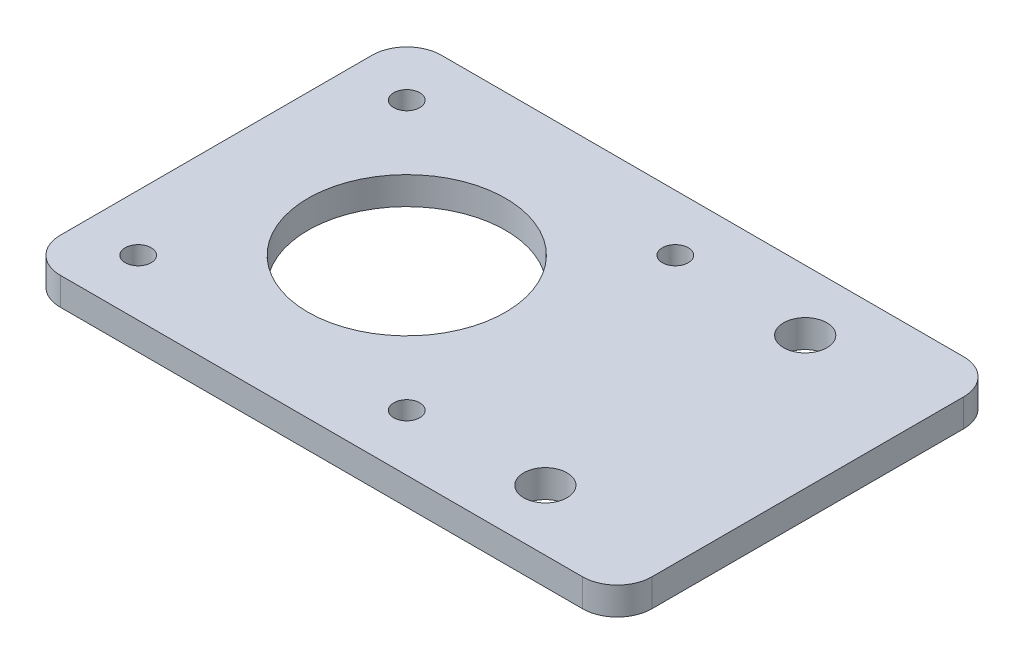
ISO-10303-21;
HEADER;
FILE_DESCRIPTION(('STEP AP214'),'2;1');
FILE_NAME('part.step','',(''),(''),'','','');
FILE_SCHEMA(('AUTOMOTIVE_DESIGN { 1 0 10303 214 1 1 1 1 }'));
ENDSEC;
DATA;
#1=APPLICATION_CONTEXT('core data for automotive mechanical design processes');
#2=APPLICATION_PROTOCOL_DEFINITION('international standard','automotive_design',2000,#1);
#3=PRODUCT_CONTEXT('',#1,'mechanical');
#4=PRODUCT('Part','Part','',(#3));
#5=PRODUCT_RELATED_PRODUCT_CATEGORY('part','',(#4));
#6=PRODUCT_DEFINITION_FORMATION('','',#4);
#7=PRODUCT_DEFINITION_CONTEXT('part definition',#1,'design');
#8=PRODUCT_DEFINITION('design','',#6,#7);
#9=PRODUCT_DEFINITION_SHAPE('','',#8);
#10=(LENGTH_UNIT() NAMED_UNIT(*) SI_UNIT(.MILLI.,.METRE.));
#11=(NAMED_UNIT(*) PLANE_ANGLE_UNIT() SI_UNIT($,.RADIAN.));
#12=(NAMED_UNIT(*) SI_UNIT($,.STERADIAN.) SOLID_ANGLE_UNIT());
#13=UNCERTAINTY_MEASURE_WITH_UNIT(LENGTH_MEASURE(1.E-05),#10,'distance_accuracy_value','');
#14=(GEOMETRIC_REPRESENTATION_CONTEXT(3) GLOBAL_UNCERTAINTY_ASSIGNED_CONTEXT((#13)) GLOBAL_UNIT_ASSIGNED_CONTEXT((#10,
#11,#12)) REPRESENTATION_CONTEXT('',''));
#15=CARTESIAN_POINT('',(0.,0.,0.));
#16=DIRECTION('',(0.,0.,1.));
#17=DIRECTION('',(1.,0.,0.));
#18=AXIS2_PLACEMENT_3D('',#15,#16,#17);
#19=CARTESIAN_POINT('',(34.15,3.2,-22.));
#20=DIRECTION('',(-1.,0.,0.));
#21=DIRECTION('',(0.,0.,1.));
#22=AXIS2_PLACEMENT_3D('',#19,#20,#21);
#23=PLANE('',#22);
#24=DIRECTION('',(0.,0.,-1.));
#25=VECTOR('',#24,1.);
#26=CARTESIAN_POINT('',(34.15,3.2,-22.));
#27=LINE('',#26,#25);
#28=CARTESIAN_POINT('',(34.15,3.2,18.));
#29=VERTEX_POINT('',#28);
#30=CARTESIAN_POINT('',(34.15,3.2,-18.));
#31=VERTEX_POINT('',#30);
#32=EDGE_CURVE('E117',#29,#31,#27,.T.);
#33=ORIENTED_EDGE('',*,*,#32,.F.);
#34=DIRECTION('',(0.,-1.,0.));
#35=VECTOR('',#34,1.);
#36=CARTESIAN_POINT('',(34.15,3.2,18.));
#37=LINE('',#36,#35);
#38=CARTESIAN_POINT('',(34.15,0.,18.));
#39=VERTEX_POINT('',#38);
#40=EDGE_CURVE('E102',#29,#39,#37,.T.);
#41=ORIENTED_EDGE('',*,*,#40,.T.);
#42=DIRECTION('',(0.,0.,-1.));
#43=VECTOR('',#42,1.);
#44=CARTESIAN_POINT('',(34.15,0.,-22.));
#45=LINE('',#44,#43);
#46=CARTESIAN_POINT('',(34.15,0.,-18.));
#47=VERTEX_POINT('',#46);
#48=EDGE_CURVE('E114',#39,#47,#45,.T.);
#49=ORIENTED_EDGE('',*,*,#48,.T.);
#50=DIRECTION('',(0.,-1.,0.));
#51=VECTOR('',#50,1.);
#52=CARTESIAN_POINT('',(34.15,3.2,-18.));
#53=LINE('',#52,#51);
#54=EDGE_CURVE('E119',#47,#31,#53,.F.);
#55=ORIENTED_EDGE('',*,*,#54,.T.);
#56=EDGE_LOOP('',(#33,#41,#49,#55));
#57=FACE_BOUND('',#56,.T.);
#58=ADVANCED_FACE('F32',(#57),#23,.F.);
#59=CARTESIAN_POINT('',(-34.15,3.2,-22.));
#60=DIRECTION('',(0.,0.,1.));
#61=DIRECTION('',(1.,0.,0.));
#62=AXIS2_PLACEMENT_3D('',#59,#60,#61);
#63=PLANE('',#62);
#64=DIRECTION('',(-1.,0.,0.));
#65=VECTOR('',#64,1.);
#66=CARTESIAN_POINT('',(-34.15,0.,-22.));
#67=LINE('',#66,#65);
#68=CARTESIAN_POINT('',(30.15,0.,-22.));
#69=VERTEX_POINT('',#68);
#70=CARTESIAN_POINT('',(-30.15,0.,-22.));
#71=VERTEX_POINT('',#70);
#72=EDGE_CURVE('E123',#69,#71,#67,.T.);
#73=ORIENTED_EDGE('',*,*,#72,.T.);
#74=DIRECTION('',(0.,-1.,0.));
#75=VECTOR('',#74,1.);
#76=CARTESIAN_POINT('',(-30.15,3.2,-22.));
#77=LINE('',#76,#75);
#78=CARTESIAN_POINT('',(-30.15,3.2,-22.));
#79=VERTEX_POINT('',#78);
#80=EDGE_CURVE('E11',#71,#79,#77,.F.);
#81=ORIENTED_EDGE('',*,*,#80,.T.);
#82=DIRECTION('',(-1.,0.,0.));
#83=VECTOR('',#82,1.);
#84=CARTESIAN_POINT('',(-34.15,3.2,-22.));
#85=LINE('',#84,#83);
#86=CARTESIAN_POINT('',(30.15,3.2,-22.));
#87=VERTEX_POINT('',#86);
#88=EDGE_CURVE('E163',#87,#79,#85,.T.);
#89=ORIENTED_EDGE('',*,*,#88,.F.);
#90=DIRECTION('',(0.,-1.,0.));
#91=VECTOR('',#90,1.);
#92=CARTESIAN_POINT('',(30.15,3.2,-22.));
#93=LINE('',#92,#91);
#94=EDGE_CURVE('E40',#87,#69,#93,.T.);
#95=ORIENTED_EDGE('',*,*,#94,.T.);
#96=EDGE_LOOP('',(#73,#81,#89,#95));
#97=FACE_BOUND('',#96,.T.);
#98=ADVANCED_FACE('F161',(#97),#63,.F.);
#99=CARTESIAN_POINT('',(-34.15,3.2,-22.));
#100=DIRECTION('',(1.,0.,0.));
#101=DIRECTION('',(0.,0.,-1.));
#102=AXIS2_PLACEMENT_3D('',#99,#100,#101);
#103=PLANE('',#102);
#104=DIRECTION('',(0.,0.,1.));
#105=VECTOR('',#104,1.);
#106=CARTESIAN_POINT('',(-34.15,0.,-22.));
#107=LINE('',#106,#105);
#108=CARTESIAN_POINT('',(-34.15,0.,-18.));
#109=VERTEX_POINT('',#108);
#110=CARTESIAN_POINT('',(-34.15,0.,18.));
#111=VERTEX_POINT('',#110);
#112=EDGE_CURVE('E127',#109,#111,#107,.T.);
#113=ORIENTED_EDGE('',*,*,#112,.T.);
#114=DIRECTION('',(0.,-1.,0.));
#115=VECTOR('',#114,1.);
#116=CARTESIAN_POINT('',(-34.15,3.2,18.));
#117=LINE('',#116,#115);
#118=CARTESIAN_POINT('',(-34.15,3.2,18.));
#119=VERTEX_POINT('',#118);
#120=EDGE_CURVE('E47',#111,#119,#117,.F.);
#121=ORIENTED_EDGE('',*,*,#120,.T.);
#122=DIRECTION('',(0.,0.,1.));
#123=VECTOR('',#122,1.);
#124=CARTESIAN_POINT('',(-34.15,3.2,-22.));
#125=LINE('',#124,#123);
#126=CARTESIAN_POINT('',(-34.15,3.2,-18.));
#127=VERTEX_POINT('',#126);
#128=EDGE_CURVE('E171',#127,#119,#125,.T.);
#129=ORIENTED_EDGE('',*,*,#128,.F.);
#130=DIRECTION('',(0.,-1.,0.));
#131=VECTOR('',#130,1.);
#132=CARTESIAN_POINT('',(-34.15,3.2,-18.));
#133=LINE('',#132,#131);
#134=EDGE_CURVE('E154',#127,#109,#133,.T.);
#135=ORIENTED_EDGE('',*,*,#134,.T.);
#136=EDGE_LOOP('',(#113,#121,#129,#135));
#137=FACE_BOUND('',#136,.T.);
#138=ADVANCED_FACE('F170',(#137),#103,.F.);
#139=CARTESIAN_POINT('',(-34.15,3.2,22.));
#140=DIRECTION('',(0.,0.,-1.));
#141=DIRECTION('',(-1.,0.,0.));
#142=AXIS2_PLACEMENT_3D('',#139,#140,#141);
#143=PLANE('',#142);
#144=DIRECTION('',(1.,0.,0.));
#145=VECTOR('',#144,1.);
#146=CARTESIAN_POINT('',(-34.15,0.,22.));
#147=LINE('',#146,#145);
#148=CARTESIAN_POINT('',(-30.15,0.,22.));
#149=VERTEX_POINT('',#148);
#150=CARTESIAN_POINT('',(30.15,0.,22.));
#151=VERTEX_POINT('',#150);
#152=EDGE_CURVE('E137',#149,#151,#147,.T.);
#153=ORIENTED_EDGE('',*,*,#152,.T.);
#154=DIRECTION('',(0.,-1.,0.));
#155=VECTOR('',#154,1.);
#156=CARTESIAN_POINT('',(30.15,3.2,22.));
#157=LINE('',#156,#155);
#158=CARTESIAN_POINT('',(30.15,3.2,22.));
#159=VERTEX_POINT('',#158);
#160=EDGE_CURVE('E103',#151,#159,#157,.F.);
#161=ORIENTED_EDGE('',*,*,#160,.T.);
#162=DIRECTION('',(1.,0.,0.));
#163=VECTOR('',#162,1.);
#164=CARTESIAN_POINT('',(-34.15,3.2,22.));
#165=LINE('',#164,#163);
#166=CARTESIAN_POINT('',(-30.15,3.2,22.));
#167=VERTEX_POINT('',#166);
#168=EDGE_CURVE('E133',#167,#159,#165,.T.);
#169=ORIENTED_EDGE('',*,*,#168,.F.);
#170=DIRECTION('',(0.,-1.,0.));
#171=VECTOR('',#170,1.);
#172=CARTESIAN_POINT('',(-30.15,3.2,22.));
#173=LINE('',#172,#171);
#174=EDGE_CURVE('E108',#167,#149,#173,.T.);
#175=ORIENTED_EDGE('',*,*,#174,.T.);
#176=EDGE_LOOP('',(#153,#161,#169,#175));
#177=FACE_BOUND('',#176,.T.);
#178=ADVANCED_FACE('F229',(#177),#143,.F.);
#179=CARTESIAN_POINT('',(0.,3.2,0.));
#180=DIRECTION('',(0.,1.,0.));
#181=DIRECTION('',(0.,0.,1.));
#182=AXIS2_PLACEMENT_3D('',#179,#180,#181);
#183=PLANE('',#182);
#184=CARTESIAN_POINT('',(18.85,3.2,-15.));
#185=DIRECTION('',(0.,1.,0.));
#186=DIRECTION('',(0.,0.,1.));
#187=AXIS2_PLACEMENT_3D('',#184,#185,#186);
#188=CIRCLE('',#187,2.5);
#189=CARTESIAN_POINT('',(18.85,3.2,-12.5));
#190=VERTEX_POINT('',#189);
#191=EDGE_CURVE('E199',#190,#190,#188,.T.);
#192=ORIENTED_EDGE('',*,*,#191,.F.);
#193=EDGE_LOOP('',(#192));
#194=FACE_BOUND('',#193,.T.);
#195=CARTESIAN_POINT('',(18.85,3.2,15.));
#196=DIRECTION('',(0.,1.,0.));
#197=DIRECTION('',(0.,0.,1.));
#198=AXIS2_PLACEMENT_3D('',#195,#196,#197);
#199=CIRCLE('',#198,2.5);
#200=CARTESIAN_POINT('',(18.85,3.2,17.5));
#201=VERTEX_POINT('',#200);
#202=EDGE_CURVE('E193',#201,#201,#199,.T.);
#203=ORIENTED_EDGE('',*,*,#202,.F.);
#204=EDGE_LOOP('',(#203));
#205=FACE_BOUND('',#204,.T.);
#206=CARTESIAN_POINT('',(-27.65,3.2,-15.5));
#207=DIRECTION('',(0.,1.,0.));
#208=DIRECTION('',(0.,0.,1.));
#209=AXIS2_PLACEMENT_3D('',#206,#207,#208);
#210=CIRCLE('',#209,1.5);
#211=CARTESIAN_POINT('',(-27.65,3.2,-14.));
#212=VERTEX_POINT('',#211);
#213=EDGE_CURVE('E187',#212,#212,#210,.T.);
#214=ORIENTED_EDGE('',*,*,#213,.F.);
#215=EDGE_LOOP('',(#214));
#216=FACE_BOUND('',#215,.T.);
#217=CARTESIAN_POINT('',(3.35000000000002,3.2,-15.5));
#218=DIRECTION('',(0.,1.,0.));
#219=DIRECTION('',(0.,0.,1.));
#220=AXIS2_PLACEMENT_3D('',#217,#218,#219);
#221=CIRCLE('',#220,1.5);
#222=CARTESIAN_POINT('',(3.35000000000002,3.2,-14.));
#223=VERTEX_POINT('',#222);
#224=EDGE_CURVE('E180',#223,#223,#221,.T.);
#225=ORIENTED_EDGE('',*,*,#224,.F.);
#226=EDGE_LOOP('',(#225));
#227=FACE_BOUND('',#226,.T.);
#228=CARTESIAN_POINT('',(3.35000000000002,3.2,15.5));
#229=DIRECTION('',(0.,1.,0.));
#230=DIRECTION('',(0.,0.,1.));
#231=AXIS2_PLACEMENT_3D('',#228,#229,#230);
#232=CIRCLE('',#231,1.5);
#233=CARTESIAN_POINT('',(3.35000000000002,3.2,17.));
#234=VERTEX_POINT('',#233);
#235=EDGE_CURVE('E210',#234,#234,#232,.T.);
#236=ORIENTED_EDGE('',*,*,#235,.F.);
#237=EDGE_LOOP('',(#236));
#238=FACE_BOUND('',#237,.T.);
#239=CARTESIAN_POINT('',(-27.65,3.2,15.5));
#240=DIRECTION('',(0.,1.,0.));
#241=DIRECTION('',(0.,0.,1.));
#242=AXIS2_PLACEMENT_3D('',#239,#240,#241);
#243=CIRCLE('',#242,1.5);
#244=CARTESIAN_POINT('',(-27.65,3.2,17.));
#245=VERTEX_POINT('',#244);
#246=EDGE_CURVE('E204',#245,#245,#243,.T.);
#247=ORIENTED_EDGE('',*,*,#246,.F.);
#248=EDGE_LOOP('',(#247));
#249=FACE_BOUND('',#248,.T.);
#250=CARTESIAN_POINT('',(-12.15,3.2,0.));
#251=DIRECTION('',(0.,1.,0.));
#252=DIRECTION('',(0.,0.,1.));
#253=AXIS2_PLACEMENT_3D('',#250,#251,#252);
#254=CIRCLE('',#253,11.4);
#255=CARTESIAN_POINT('',(-12.15,3.2,11.4));
#256=VERTEX_POINT('',#255);
#257=EDGE_CURVE('E130',#256,#256,#254,.T.);
#258=ORIENTED_EDGE('',*,*,#257,.F.);
#259=EDGE_LOOP('',(#258));
#260=FACE_BOUND('',#259,.T.);
#261=ORIENTED_EDGE('',*,*,#168,.T.);
#262=CARTESIAN_POINT('',(30.15,3.2,18.));
#263=DIRECTION('',(0.,1.,0.));
#264=DIRECTION('',(0.,0.,1.));
#265=AXIS2_PLACEMENT_3D('',#262,#263,#264);
#266=CIRCLE('',#265,4.);
#267=EDGE_CURVE('E152',#159,#29,#266,.T.);
#268=ORIENTED_EDGE('',*,*,#267,.T.);
#269=ORIENTED_EDGE('',*,*,#32,.T.);
#270=CARTESIAN_POINT('',(30.15,3.2,-18.));
#271=DIRECTION('',(0.,1.,0.));
#272=DIRECTION('',(0.,0.,1.));
#273=AXIS2_PLACEMENT_3D('',#270,#271,#272);
#274=CIRCLE('',#273,4.);
#275=EDGE_CURVE('E147',#31,#87,#274,.T.);
#276=ORIENTED_EDGE('',*,*,#275,.T.);
#277=ORIENTED_EDGE('',*,*,#88,.T.);
#278=CARTESIAN_POINT('',(-30.15,3.2,-18.));
#279=DIRECTION('',(0.,1.,0.));
#280=DIRECTION('',(0.,0.,1.));
#281=AXIS2_PLACEMENT_3D('',#278,#279,#280);
#282=CIRCLE('',#281,4.);
#283=EDGE_CURVE('E54',#79,#127,#282,.T.);
#284=ORIENTED_EDGE('',*,*,#283,.T.);
#285=ORIENTED_EDGE('',*,*,#128,.T.);
#286=CARTESIAN_POINT('',(-30.15,3.2,18.));
#287=DIRECTION('',(0.,1.,0.));
#288=DIRECTION('',(0.,0.,1.));
#289=AXIS2_PLACEMENT_3D('',#286,#287,#288);
#290=CIRCLE('',#289,4.);
#291=EDGE_CURVE('E150',#119,#167,#290,.T.);
#292=ORIENTED_EDGE('',*,*,#291,.T.);
#293=EDGE_LOOP('',(#261,#268,#269,#276,#277,#284,#285,#292));
#294=FACE_BOUND('',#293,.T.);
#295=ADVANCED_FACE('F226',(#194,#205,#216,#227,#238,#249,#260,#294),#183,.T.);
#296=CARTESIAN_POINT('',(0.,0.,0.));
#297=DIRECTION('',(0.,1.,0.));
#298=DIRECTION('',(0.,0.,1.));
#299=AXIS2_PLACEMENT_3D('',#296,#297,#298);
#300=PLANE('',#299);
#301=CARTESIAN_POINT('',(18.85,0.,-15.));
#302=DIRECTION('',(0.,1.,0.));
#303=DIRECTION('',(0.,0.,1.));
#304=AXIS2_PLACEMENT_3D('',#301,#302,#303);
#305=CIRCLE('',#304,2.5);
#306=CARTESIAN_POINT('',(18.85,0.,-12.5));
#307=VERTEX_POINT('',#306);
#308=EDGE_CURVE('E178',#307,#307,#305,.T.);
#309=ORIENTED_EDGE('',*,*,#308,.T.);
#310=EDGE_LOOP('',(#309));
#311=FACE_BOUND('',#310,.T.);
#312=CARTESIAN_POINT('',(18.85,0.,15.));
#313=DIRECTION('',(0.,1.,0.));
#314=DIRECTION('',(0.,0.,1.));
#315=AXIS2_PLACEMENT_3D('',#312,#313,#314);
#316=CIRCLE('',#315,2.5);
#317=CARTESIAN_POINT('',(18.85,0.,17.5));
#318=VERTEX_POINT('',#317);
#319=EDGE_CURVE('E196',#318,#318,#316,.T.);
#320=ORIENTED_EDGE('',*,*,#319,.T.);
#321=EDGE_LOOP('',(#320));
#322=FACE_BOUND('',#321,.T.);
#323=CARTESIAN_POINT('',(-27.65,0.,-15.5));
#324=DIRECTION('',(0.,1.,0.));
#325=DIRECTION('',(0.,0.,1.));
#326=AXIS2_PLACEMENT_3D('',#323,#324,#325);
#327=CIRCLE('',#326,1.5);
#328=CARTESIAN_POINT('',(-27.65,0.,-14.));
#329=VERTEX_POINT('',#328);
#330=EDGE_CURVE('E190',#329,#329,#327,.T.);
#331=ORIENTED_EDGE('',*,*,#330,.T.);
#332=EDGE_LOOP('',(#331));
#333=FACE_BOUND('',#332,.T.);
#334=CARTESIAN_POINT('',(3.35000000000002,0.,-15.5));
#335=DIRECTION('',(0.,1.,0.));
#336=DIRECTION('',(0.,0.,1.));
#337=AXIS2_PLACEMENT_3D('',#334,#335,#336);
#338=CIRCLE('',#337,1.5);
#339=CARTESIAN_POINT('',(3.35000000000002,0.,-14.));
#340=VERTEX_POINT('',#339);
#341=EDGE_CURVE('E183',#340,#340,#338,.T.);
#342=ORIENTED_EDGE('',*,*,#341,.T.);
#343=EDGE_LOOP('',(#342));
#344=FACE_BOUND('',#343,.T.);
#345=CARTESIAN_POINT('',(3.35000000000002,0.,15.5));
#346=DIRECTION('',(0.,1.,0.));
#347=DIRECTION('',(0.,0.,1.));
#348=AXIS2_PLACEMENT_3D('',#345,#346,#347);
#349=CIRCLE('',#348,1.5);
#350=CARTESIAN_POINT('',(3.35000000000002,0.,17.));
#351=VERTEX_POINT('',#350);
#352=EDGE_CURVE('E184',#351,#351,#349,.T.);
#353=ORIENTED_EDGE('',*,*,#352,.T.);
#354=EDGE_LOOP('',(#353));
#355=FACE_BOUND('',#354,.T.);
#356=CARTESIAN_POINT('',(-27.65,0.,15.5));
#357=DIRECTION('',(0.,1.,0.));
#358=DIRECTION('',(0.,0.,1.));
#359=AXIS2_PLACEMENT_3D('',#356,#357,#358);
#360=CIRCLE('',#359,1.5);
#361=CARTESIAN_POINT('',(-27.65,0.,17.));
#362=VERTEX_POINT('',#361);
#363=EDGE_CURVE('E207',#362,#362,#360,.T.);
#364=ORIENTED_EDGE('',*,*,#363,.T.);
#365=EDGE_LOOP('',(#364));
#366=FACE_BOUND('',#365,.T.);
#367=CARTESIAN_POINT('',(-12.15,0.,0.));
#368=DIRECTION('',(0.,1.,0.));
#369=DIRECTION('',(0.,0.,1.));
#370=AXIS2_PLACEMENT_3D('',#367,#368,#369);
#371=CIRCLE('',#370,11.4);
#372=CARTESIAN_POINT('',(-12.15,0.,11.4));
#373=VERTEX_POINT('',#372);
#374=EDGE_CURVE('E124',#373,#373,#371,.T.);
#375=ORIENTED_EDGE('',*,*,#374,.T.);
#376=EDGE_LOOP('',(#375));
#377=FACE_BOUND('',#376,.T.);
#378=ORIENTED_EDGE('',*,*,#48,.F.);
#379=CARTESIAN_POINT('',(30.15,0.,18.));
#380=DIRECTION('',(0.,1.,0.));
#381=DIRECTION('',(0.,0.,1.));
#382=AXIS2_PLACEMENT_3D('',#379,#380,#381);
#383=CIRCLE('',#382,4.);
#384=EDGE_CURVE('E98',#39,#151,#383,.F.);
#385=ORIENTED_EDGE('',*,*,#384,.T.);
#386=ORIENTED_EDGE('',*,*,#152,.F.);
#387=CARTESIAN_POINT('',(-30.15,0.,18.));
#388=DIRECTION('',(0.,1.,0.));
#389=DIRECTION('',(0.,0.,1.));
#390=AXIS2_PLACEMENT_3D('',#387,#388,#389);
#391=CIRCLE('',#390,4.);
#392=EDGE_CURVE('E109',#149,#111,#391,.F.);
#393=ORIENTED_EDGE('',*,*,#392,.T.);
#394=ORIENTED_EDGE('',*,*,#112,.F.);
#395=CARTESIAN_POINT('',(-30.15,0.,-18.));
#396=DIRECTION('',(0.,1.,0.));
#397=DIRECTION('',(0.,0.,1.));
#398=AXIS2_PLACEMENT_3D('',#395,#396,#397);
#399=CIRCLE('',#398,4.);
#400=EDGE_CURVE('E141',#109,#71,#399,.F.);
#401=ORIENTED_EDGE('',*,*,#400,.T.);
#402=ORIENTED_EDGE('',*,*,#72,.F.);
#403=CARTESIAN_POINT('',(30.15,0.,-18.));
#404=DIRECTION('',(0.,1.,0.));
#405=DIRECTION('',(0.,0.,1.));
#406=AXIS2_PLACEMENT_3D('',#403,#404,#405);
#407=CIRCLE('',#406,4.);
#408=EDGE_CURVE('E118',#69,#47,#407,.F.);
#409=ORIENTED_EDGE('',*,*,#408,.T.);
#410=EDGE_LOOP('',(#378,#385,#386,#393,#394,#401,#402,#409));
#411=FACE_BOUND('',#410,.T.);
#412=ADVANCED_FACE('F121',(#311,#322,#333,#344,#355,#366,#377,#411),#300,.F.);
#413=CARTESIAN_POINT('',(-12.15,0.,0.));
#414=DIRECTION('',(0.,1.,0.));
#415=DIRECTION('',(0.,0.,1.));
#416=AXIS2_PLACEMENT_3D('',#413,#414,#415);
#417=CYLINDRICAL_SURFACE('',#416,11.4);
#418=ORIENTED_EDGE('',*,*,#374,.F.);
#419=EDGE_LOOP('',(#418));
#420=FACE_BOUND('',#419,.T.);
#421=ORIENTED_EDGE('',*,*,#257,.T.);
#422=EDGE_LOOP('',(#421));
#423=FACE_BOUND('',#422,.T.);
#424=ADVANCED_FACE('F260',(#420,#423),#417,.F.);
#425=CARTESIAN_POINT('',(-27.65,0.,15.5));
#426=DIRECTION('',(0.,1.,0.));
#427=DIRECTION('',(0.,0.,1.));
#428=AXIS2_PLACEMENT_3D('',#425,#426,#427);
#429=CYLINDRICAL_SURFACE('',#428,1.5);
#430=ORIENTED_EDGE('',*,*,#363,.F.);
#431=EDGE_LOOP('',(#430));
#432=FACE_BOUND('',#431,.T.);
#433=ORIENTED_EDGE('',*,*,#246,.T.);
#434=EDGE_LOOP('',(#433));
#435=FACE_BOUND('',#434,.T.);
#436=ADVANCED_FACE('F222',(#432,#435),#429,.F.);
#437=CARTESIAN_POINT('',(3.35000000000002,0.,15.5));
#438=DIRECTION('',(0.,1.,0.));
#439=DIRECTION('',(0.,0.,1.));
#440=AXIS2_PLACEMENT_3D('',#437,#438,#439);
#441=CYLINDRICAL_SURFACE('',#440,1.5);
#442=ORIENTED_EDGE('',*,*,#352,.F.);
#443=EDGE_LOOP('',(#442));
#444=FACE_BOUND('',#443,.T.);
#445=ORIENTED_EDGE('',*,*,#235,.T.);
#446=EDGE_LOOP('',(#445));
#447=FACE_BOUND('',#446,.T.);
#448=ADVANCED_FACE('F218',(#444,#447),#441,.F.);
#449=CARTESIAN_POINT('',(3.35000000000002,0.,-15.5));
#450=DIRECTION('',(0.,1.,0.));
#451=DIRECTION('',(0.,0.,1.));
#452=AXIS2_PLACEMENT_3D('',#449,#450,#451);
#453=CYLINDRICAL_SURFACE('',#452,1.5);
#454=ORIENTED_EDGE('',*,*,#341,.F.);
#455=EDGE_LOOP('',(#454));
#456=FACE_BOUND('',#455,.T.);
#457=ORIENTED_EDGE('',*,*,#224,.T.);
#458=EDGE_LOOP('',(#457));
#459=FACE_BOUND('',#458,.T.);
#460=ADVANCED_FACE('F221',(#456,#459),#453,.F.);
#461=CARTESIAN_POINT('',(-27.65,0.,-15.5));
#462=DIRECTION('',(0.,1.,0.));
#463=DIRECTION('',(0.,0.,1.));
#464=AXIS2_PLACEMENT_3D('',#461,#462,#463);
#465=CYLINDRICAL_SURFACE('',#464,1.5);
#466=ORIENTED_EDGE('',*,*,#330,.F.);
#467=EDGE_LOOP('',(#466));
#468=FACE_BOUND('',#467,.T.);
#469=ORIENTED_EDGE('',*,*,#213,.T.);
#470=EDGE_LOOP('',(#469));
#471=FACE_BOUND('',#470,.T.);
#472=ADVANCED_FACE('F268',(#468,#471),#465,.F.);
#473=CARTESIAN_POINT('',(18.85,0.,15.));
#474=DIRECTION('',(0.,1.,0.));
#475=DIRECTION('',(0.,0.,1.));
#476=AXIS2_PLACEMENT_3D('',#473,#474,#475);
#477=CYLINDRICAL_SURFACE('',#476,2.5);
#478=ORIENTED_EDGE('',*,*,#319,.F.);
#479=EDGE_LOOP('',(#478));
#480=FACE_BOUND('',#479,.T.);
#481=ORIENTED_EDGE('',*,*,#202,.T.);
#482=EDGE_LOOP('',(#481));
#483=FACE_BOUND('',#482,.T.);
#484=ADVANCED_FACE('F272',(#480,#483),#477,.F.);
#485=CARTESIAN_POINT('',(18.85,0.,-15.));
#486=DIRECTION('',(0.,1.,0.));
#487=DIRECTION('',(0.,0.,1.));
#488=AXIS2_PLACEMENT_3D('',#485,#486,#487);
#489=CYLINDRICAL_SURFACE('',#488,2.5);
#490=ORIENTED_EDGE('',*,*,#308,.F.);
#491=EDGE_LOOP('',(#490));
#492=FACE_BOUND('',#491,.T.);
#493=ORIENTED_EDGE('',*,*,#191,.T.);
#494=EDGE_LOOP('',(#493));
#495=FACE_BOUND('',#494,.T.);
#496=ADVANCED_FACE('F246',(#492,#495),#489,.F.);
#497=CARTESIAN_POINT('',(30.15,3.2,18.));
#498=DIRECTION('',(0.,-1.,0.));
#499=DIRECTION('',(0.,0.,-1.));
#500=AXIS2_PLACEMENT_3D('',#497,#498,#499);
#501=CYLINDRICAL_SURFACE('',#500,4.);
#502=ORIENTED_EDGE('',*,*,#267,.F.);
#503=ORIENTED_EDGE('',*,*,#160,.F.);
#504=ORIENTED_EDGE('',*,*,#384,.F.);
#505=ORIENTED_EDGE('',*,*,#40,.F.);
#506=EDGE_LOOP('',(#502,#503,#504,#505));
#507=FACE_BOUND('',#506,.T.);
#508=ADVANCED_FACE('F101',(#507),#501,.T.);
#509=CARTESIAN_POINT('',(-30.15,3.2,18.));
#510=DIRECTION('',(0.,-1.,0.));
#511=DIRECTION('',(0.,0.,-1.));
#512=AXIS2_PLACEMENT_3D('',#509,#510,#511);
#513=CYLINDRICAL_SURFACE('',#512,4.);
#514=ORIENTED_EDGE('',*,*,#291,.F.);
#515=ORIENTED_EDGE('',*,*,#120,.F.);
#516=ORIENTED_EDGE('',*,*,#392,.F.);
#517=ORIENTED_EDGE('',*,*,#174,.F.);
#518=EDGE_LOOP('',(#514,#515,#516,#517));
#519=FACE_BOUND('',#518,.T.);
#520=ADVANCED_FACE('F239',(#519),#513,.T.);
#521=CARTESIAN_POINT('',(-30.15,3.2,-18.));
#522=DIRECTION('',(0.,-1.,0.));
#523=DIRECTION('',(0.,0.,-1.));
#524=AXIS2_PLACEMENT_3D('',#521,#522,#523);
#525=CYLINDRICAL_SURFACE('',#524,4.);
#526=ORIENTED_EDGE('',*,*,#283,.F.);
#527=ORIENTED_EDGE('',*,*,#80,.F.);
#528=ORIENTED_EDGE('',*,*,#400,.F.);
#529=ORIENTED_EDGE('',*,*,#134,.F.);
#530=EDGE_LOOP('',(#526,#527,#528,#529));
#531=FACE_BOUND('',#530,.T.);
#532=ADVANCED_FACE('F169',(#531),#525,.T.);
#533=CARTESIAN_POINT('',(30.15,3.2,-18.));
#534=DIRECTION('',(0.,-1.,0.));
#535=DIRECTION('',(0.,0.,-1.));
#536=AXIS2_PLACEMENT_3D('',#533,#534,#535);
#537=CYLINDRICAL_SURFACE('',#536,4.);
#538=ORIENTED_EDGE('',*,*,#275,.F.);
#539=ORIENTED_EDGE('',*,*,#54,.F.);
#540=ORIENTED_EDGE('',*,*,#408,.F.);
#541=ORIENTED_EDGE('',*,*,#94,.F.);
#542=EDGE_LOOP('',(#538,#539,#540,#541));
#543=FACE_BOUND('',#542,.T.);
#544=ADVANCED_FACE('F34',(#543),#537,.T.);
#545=CLOSED_SHELL('',(#58,#98,#138,#178,#295,#412,#424,#436,#448,#460,#472,#484,#496,#508,#520,
#532,#544));
#546=MANIFOLD_SOLID_BREP('B2',#545);
#547=ADVANCED_BREP_SHAPE_REPRESENTATION('',(#18,#546),#14);
#548=SHAPE_DEFINITION_REPRESENTATION(#9,#547);
ENDSEC;
END-ISO-10303-21;
